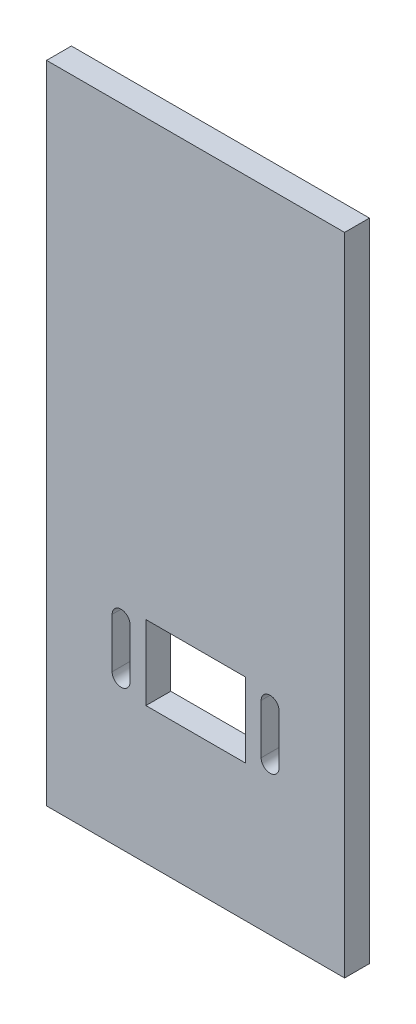
ISO-10303-21;
HEADER;
FILE_DESCRIPTION(('STEP AP214'),'2;1');
FILE_NAME('part.step','',(''),(''),'','','');
FILE_SCHEMA(('AUTOMOTIVE_DESIGN { 1 0 10303 214 1 1 1 1 }'));
ENDSEC;
DATA;
#1=APPLICATION_CONTEXT('core data for automotive mechanical design processes');
#2=APPLICATION_PROTOCOL_DEFINITION('international standard','automotive_design',2000,#1);
#3=PRODUCT_CONTEXT('',#1,'mechanical');
#4=PRODUCT('Part','Part','',(#3));
#5=PRODUCT_RELATED_PRODUCT_CATEGORY('part','',(#4));
#6=PRODUCT_DEFINITION_FORMATION('','',#4);
#7=PRODUCT_DEFINITION_CONTEXT('part definition',#1,'design');
#8=PRODUCT_DEFINITION('design','',#6,#7);
#9=PRODUCT_DEFINITION_SHAPE('','',#8);
#10=(LENGTH_UNIT() NAMED_UNIT(*) SI_UNIT(.MILLI.,.METRE.));
#11=(NAMED_UNIT(*) PLANE_ANGLE_UNIT() SI_UNIT($,.RADIAN.));
#12=(NAMED_UNIT(*) SI_UNIT($,.STERADIAN.) SOLID_ANGLE_UNIT());
#13=UNCERTAINTY_MEASURE_WITH_UNIT(LENGTH_MEASURE(1.E-05),#10,'distance_accuracy_value','');
#14=(GEOMETRIC_REPRESENTATION_CONTEXT(3) GLOBAL_UNCERTAINTY_ASSIGNED_CONTEXT((#13)) GLOBAL_UNIT_ASSIGNED_CONTEXT((#10,
#11,#12)) REPRESENTATION_CONTEXT('',''));
#15=CARTESIAN_POINT('',(0.,0.,0.));
#16=DIRECTION('',(0.,0.,1.));
#17=DIRECTION('',(1.,0.,0.));
#18=AXIS2_PLACEMENT_3D('',#15,#16,#17);
#19=CARTESIAN_POINT('',(30.,65.,5.));
#20=DIRECTION('',(-1.,0.,0.));
#21=DIRECTION('',(0.,-1.,0.));
#22=AXIS2_PLACEMENT_3D('',#19,#20,#21);
#23=PLANE('',#22);
#24=DIRECTION('',(0.,1.,0.));
#25=VECTOR('',#24,1.);
#26=CARTESIAN_POINT('',(30.,65.,0.));
#27=LINE('',#26,#25);
#28=CARTESIAN_POINT('',(30.,-65.,0.));
#29=VERTEX_POINT('',#28);
#30=CARTESIAN_POINT('',(30.,65.,0.));
#31=VERTEX_POINT('',#30);
#32=EDGE_CURVE('E291',#29,#31,#27,.T.);
#33=ORIENTED_EDGE('',*,*,#32,.T.);
#34=DIRECTION('',(0.,0.,-1.));
#35=VECTOR('',#34,1.);
#36=CARTESIAN_POINT('',(30.,65.,5.));
#37=LINE('',#36,#35);
#38=CARTESIAN_POINT('',(30.,65.,5.));
#39=VERTEX_POINT('',#38);
#40=EDGE_CURVE('E11',#39,#31,#37,.T.);
#41=ORIENTED_EDGE('',*,*,#40,.F.);
#42=DIRECTION('',(0.,1.,0.));
#43=VECTOR('',#42,1.);
#44=CARTESIAN_POINT('',(30.,65.,5.));
#45=LINE('',#44,#43);
#46=CARTESIAN_POINT('',(30.,-65.,5.));
#47=VERTEX_POINT('',#46);
#48=EDGE_CURVE('E292',#47,#39,#45,.T.);
#49=ORIENTED_EDGE('',*,*,#48,.F.);
#50=DIRECTION('',(0.,0.,-1.));
#51=VECTOR('',#50,1.);
#52=CARTESIAN_POINT('',(30.,-65.,5.));
#53=LINE('',#52,#51);
#54=EDGE_CURVE('E306',#47,#29,#53,.T.);
#55=ORIENTED_EDGE('',*,*,#54,.T.);
#56=EDGE_LOOP('',(#33,#41,#49,#55));
#57=FACE_BOUND('',#56,.T.);
#58=ADVANCED_FACE('F45',(#57),#23,.F.);
#59=CARTESIAN_POINT('',(-30.,65.,5.));
#60=DIRECTION('',(0.,-1.,0.));
#61=DIRECTION('',(0.,0.,-1.));
#62=AXIS2_PLACEMENT_3D('',#59,#60,#61);
#63=PLANE('',#62);
#64=DIRECTION('',(-1.,0.,0.));
#65=VECTOR('',#64,1.);
#66=CARTESIAN_POINT('',(-30.,65.,0.));
#67=LINE('',#66,#65);
#68=CARTESIAN_POINT('',(-30.,65.,0.));
#69=VERTEX_POINT('',#68);
#70=EDGE_CURVE('E310',#31,#69,#67,.T.);
#71=ORIENTED_EDGE('',*,*,#70,.T.);
#72=DIRECTION('',(0.,0.,-1.));
#73=VECTOR('',#72,1.);
#74=CARTESIAN_POINT('',(-30.,65.,5.));
#75=LINE('',#74,#73);
#76=CARTESIAN_POINT('',(-30.,65.,5.));
#77=VERTEX_POINT('',#76);
#78=EDGE_CURVE('E53',#77,#69,#75,.T.);
#79=ORIENTED_EDGE('',*,*,#78,.F.);
#80=DIRECTION('',(-1.,0.,0.));
#81=VECTOR('',#80,1.);
#82=CARTESIAN_POINT('',(-30.,65.,5.));
#83=LINE('',#82,#81);
#84=EDGE_CURVE('E296',#39,#77,#83,.T.);
#85=ORIENTED_EDGE('',*,*,#84,.F.);
#86=ORIENTED_EDGE('',*,*,#40,.T.);
#87=EDGE_LOOP('',(#71,#79,#85,#86));
#88=FACE_BOUND('',#87,.T.);
#89=ADVANCED_FACE('F345',(#88),#63,.F.);
#90=CARTESIAN_POINT('',(-30.,65.,5.));
#91=DIRECTION('',(1.,0.,0.));
#92=DIRECTION('',(0.,1.,0.));
#93=AXIS2_PLACEMENT_3D('',#90,#91,#92);
#94=PLANE('',#93);
#95=DIRECTION('',(0.,-1.,0.));
#96=VECTOR('',#95,1.);
#97=CARTESIAN_POINT('',(-30.,65.,0.));
#98=LINE('',#97,#96);
#99=CARTESIAN_POINT('',(-30.,-65.,0.));
#100=VERTEX_POINT('',#99);
#101=EDGE_CURVE('E313',#69,#100,#98,.T.);
#102=ORIENTED_EDGE('',*,*,#101,.T.);
#103=DIRECTION('',(0.,0.,-1.));
#104=VECTOR('',#103,1.);
#105=CARTESIAN_POINT('',(-30.,-65.,5.));
#106=LINE('',#105,#104);
#107=CARTESIAN_POINT('',(-30.,-65.,5.));
#108=VERTEX_POINT('',#107);
#109=EDGE_CURVE('E321',#108,#100,#106,.T.);
#110=ORIENTED_EDGE('',*,*,#109,.F.);
#111=DIRECTION('',(0.,-1.,0.));
#112=VECTOR('',#111,1.);
#113=CARTESIAN_POINT('',(-30.,65.,5.));
#114=LINE('',#113,#112);
#115=EDGE_CURVE('E300',#77,#108,#114,.T.);
#116=ORIENTED_EDGE('',*,*,#115,.F.);
#117=ORIENTED_EDGE('',*,*,#78,.T.);
#118=EDGE_LOOP('',(#102,#110,#116,#117));
#119=FACE_BOUND('',#118,.T.);
#120=ADVANCED_FACE('F330',(#119),#94,.F.);
#121=CARTESIAN_POINT('',(-30.,-65.,5.));
#122=DIRECTION('',(0.,1.,0.));
#123=DIRECTION('',(0.,0.,1.));
#124=AXIS2_PLACEMENT_3D('',#121,#122,#123);
#125=PLANE('',#124);
#126=DIRECTION('',(1.,0.,0.));
#127=VECTOR('',#126,1.);
#128=CARTESIAN_POINT('',(-30.,-65.,0.));
#129=LINE('',#128,#127);
#130=EDGE_CURVE('E297',#100,#29,#129,.T.);
#131=ORIENTED_EDGE('',*,*,#130,.T.);
#132=ORIENTED_EDGE('',*,*,#54,.F.);
#133=DIRECTION('',(1.,0.,0.));
#134=VECTOR('',#133,1.);
#135=CARTESIAN_POINT('',(-30.,-65.,5.));
#136=LINE('',#135,#134);
#137=EDGE_CURVE('E303',#108,#47,#136,.T.);
#138=ORIENTED_EDGE('',*,*,#137,.F.);
#139=ORIENTED_EDGE('',*,*,#109,.T.);
#140=EDGE_LOOP('',(#131,#132,#138,#139));
#141=FACE_BOUND('',#140,.T.);
#142=ADVANCED_FACE('F339',(#141),#125,.F.);
#143=CARTESIAN_POINT('',(0.,0.,5.));
#144=DIRECTION('',(0.,0.,1.));
#145=DIRECTION('',(1.,0.,0.));
#146=AXIS2_PLACEMENT_3D('',#143,#144,#145);
#147=PLANE('',#146);
#148=DIRECTION('',(0.,-1.,0.));
#149=VECTOR('',#148,1.);
#150=CARTESIAN_POINT('',(-13.2,-25.,5.));
#151=LINE('',#150,#149);
#152=CARTESIAN_POINT('',(-13.2,-25.,5.));
#153=VERTEX_POINT('',#152);
#154=CARTESIAN_POINT('',(-13.2,-35.,5.));
#155=VERTEX_POINT('',#154);
#156=EDGE_CURVE('E172',#153,#155,#151,.T.);
#157=ORIENTED_EDGE('',*,*,#156,.T.);
#158=CARTESIAN_POINT('',(-15.,-35.,5.));
#159=DIRECTION('',(0.,0.,1.));
#160=DIRECTION('',(1.,0.,0.));
#161=AXIS2_PLACEMENT_3D('',#158,#159,#160);
#162=CIRCLE('',#161,1.8);
#163=CARTESIAN_POINT('',(-16.8,-35.,5.));
#164=VERTEX_POINT('',#163);
#165=EDGE_CURVE('E158',#155,#164,#162,.F.);
#166=ORIENTED_EDGE('',*,*,#165,.T.);
#167=DIRECTION('',(0.,1.,0.));
#168=VECTOR('',#167,1.);
#169=CARTESIAN_POINT('',(-16.8,-25.,5.));
#170=LINE('',#169,#168);
#171=CARTESIAN_POINT('',(-16.8,-25.,5.));
#172=VERTEX_POINT('',#171);
#173=EDGE_CURVE('E195',#164,#172,#170,.T.);
#174=ORIENTED_EDGE('',*,*,#173,.T.);
#175=CARTESIAN_POINT('',(-15.,-25.,5.));
#176=DIRECTION('',(0.,0.,1.));
#177=DIRECTION('',(1.,0.,0.));
#178=AXIS2_PLACEMENT_3D('',#175,#176,#177);
#179=CIRCLE('',#178,1.8);
#180=EDGE_CURVE('E181',#172,#153,#179,.F.);
#181=ORIENTED_EDGE('',*,*,#180,.T.);
#182=EDGE_LOOP('',(#157,#166,#174,#181));
#183=FACE_BOUND('',#182,.T.);
#184=DIRECTION('',(0.,-1.,0.));
#185=VECTOR('',#184,1.);
#186=CARTESIAN_POINT('',(16.8,-25.,5.));
#187=LINE('',#186,#185);
#188=CARTESIAN_POINT('',(16.8,-25.,5.));
#189=VERTEX_POINT('',#188);
#190=CARTESIAN_POINT('',(16.8,-35.,5.));
#191=VERTEX_POINT('',#190);
#192=EDGE_CURVE('E212',#189,#191,#187,.T.);
#193=ORIENTED_EDGE('',*,*,#192,.T.);
#194=CARTESIAN_POINT('',(15.,-35.,5.));
#195=DIRECTION('',(0.,0.,1.));
#196=DIRECTION('',(1.,0.,0.));
#197=AXIS2_PLACEMENT_3D('',#194,#195,#196);
#198=CIRCLE('',#197,1.8);
#199=CARTESIAN_POINT('',(13.2,-35.,5.));
#200=VERTEX_POINT('',#199);
#201=EDGE_CURVE('E213',#191,#200,#198,.F.);
#202=ORIENTED_EDGE('',*,*,#201,.T.);
#203=DIRECTION('',(0.,1.,0.));
#204=VECTOR('',#203,1.);
#205=CARTESIAN_POINT('',(13.2,-25.,5.));
#206=LINE('',#205,#204);
#207=CARTESIAN_POINT('',(13.2,-25.,5.));
#208=VERTEX_POINT('',#207);
#209=EDGE_CURVE('E217',#200,#208,#206,.T.);
#210=ORIENTED_EDGE('',*,*,#209,.T.);
#211=CARTESIAN_POINT('',(15.,-25.,5.));
#212=DIRECTION('',(0.,0.,1.));
#213=DIRECTION('',(1.,0.,0.));
#214=AXIS2_PLACEMENT_3D('',#211,#212,#213);
#215=CIRCLE('',#214,1.8);
#216=EDGE_CURVE('E208',#208,#189,#215,.F.);
#217=ORIENTED_EDGE('',*,*,#216,.T.);
#218=EDGE_LOOP('',(#193,#202,#210,#217));
#219=FACE_BOUND('',#218,.T.);
#220=DIRECTION('',(1.,0.,0.));
#221=VECTOR('',#220,1.);
#222=CARTESIAN_POINT('',(10.,-22.5,5.));
#223=LINE('',#222,#221);
#224=CARTESIAN_POINT('',(-10.,-22.5,5.));
#225=VERTEX_POINT('',#224);
#226=CARTESIAN_POINT('',(10.,-22.5,5.00000000000001));
#227=VERTEX_POINT('',#226);
#228=EDGE_CURVE('E251',#225,#227,#223,.T.);
#229=ORIENTED_EDGE('',*,*,#228,.T.);
#230=DIRECTION('',(0.,-1.,0.));
#231=VECTOR('',#230,1.);
#232=CARTESIAN_POINT('',(10.,-22.5,5.));
#233=LINE('',#232,#231);
#234=CARTESIAN_POINT('',(10.,-37.5,5.));
#235=VERTEX_POINT('',#234);
#236=EDGE_CURVE('E278',#227,#235,#233,.T.);
#237=ORIENTED_EDGE('',*,*,#236,.T.);
#238=DIRECTION('',(-1.,0.,0.));
#239=VECTOR('',#238,1.);
#240=CARTESIAN_POINT('',(10.,-37.5,5.));
#241=LINE('',#240,#239);
#242=CARTESIAN_POINT('',(-10.,-37.5,5.));
#243=VERTEX_POINT('',#242);
#244=EDGE_CURVE('E273',#235,#243,#241,.T.);
#245=ORIENTED_EDGE('',*,*,#244,.T.);
#246=DIRECTION('',(0.,1.,0.));
#247=VECTOR('',#246,1.);
#248=CARTESIAN_POINT('',(-10.,-22.5,5.));
#249=LINE('',#248,#247);
#250=EDGE_CURVE('E267',#243,#225,#249,.T.);
#251=ORIENTED_EDGE('',*,*,#250,.T.);
#252=EDGE_LOOP('',(#229,#237,#245,#251));
#253=FACE_BOUND('',#252,.T.);
#254=ORIENTED_EDGE('',*,*,#48,.T.);
#255=ORIENTED_EDGE('',*,*,#84,.T.);
#256=ORIENTED_EDGE('',*,*,#115,.T.);
#257=ORIENTED_EDGE('',*,*,#137,.T.);
#258=EDGE_LOOP('',(#254,#255,#256,#257));
#259=FACE_BOUND('',#258,.T.);
#260=ADVANCED_FACE('F179',(#183,#219,#253,#259),#147,.T.);
#261=CARTESIAN_POINT('',(0.,0.,0.));
#262=DIRECTION('',(0.,0.,1.));
#263=DIRECTION('',(1.,0.,0.));
#264=AXIS2_PLACEMENT_3D('',#261,#262,#263);
#265=PLANE('',#264);
#266=CARTESIAN_POINT('',(-15.,-35.,0.));
#267=DIRECTION('',(0.,0.,-1.));
#268=DIRECTION('',(-1.,0.,0.));
#269=AXIS2_PLACEMENT_3D('',#266,#267,#268);
#270=CIRCLE('',#269,1.8);
#271=CARTESIAN_POINT('',(-13.2,-35.,0.));
#272=VERTEX_POINT('',#271);
#273=CARTESIAN_POINT('',(-16.8,-35.,0.));
#274=VERTEX_POINT('',#273);
#275=EDGE_CURVE('E186',#272,#274,#270,.T.);
#276=ORIENTED_EDGE('',*,*,#275,.F.);
#277=DIRECTION('',(0.,-1.,0.));
#278=VECTOR('',#277,1.);
#279=CARTESIAN_POINT('',(-13.2,-25.,0.));
#280=LINE('',#279,#278);
#281=CARTESIAN_POINT('',(-13.2,-25.,0.));
#282=VERTEX_POINT('',#281);
#283=EDGE_CURVE('E175',#282,#272,#280,.T.);
#284=ORIENTED_EDGE('',*,*,#283,.F.);
#285=CARTESIAN_POINT('',(-15.,-25.,0.));
#286=DIRECTION('',(0.,0.,-1.));
#287=DIRECTION('',(-1.,0.,0.));
#288=AXIS2_PLACEMENT_3D('',#285,#286,#287);
#289=CIRCLE('',#288,1.8);
#290=CARTESIAN_POINT('',(-16.8,-25.,0.));
#291=VERTEX_POINT('',#290);
#292=EDGE_CURVE('E190',#291,#282,#289,.T.);
#293=ORIENTED_EDGE('',*,*,#292,.F.);
#294=DIRECTION('',(0.,1.,0.));
#295=VECTOR('',#294,1.);
#296=CARTESIAN_POINT('',(-16.8,-25.,0.));
#297=LINE('',#296,#295);
#298=EDGE_CURVE('E183',#274,#291,#297,.T.);
#299=ORIENTED_EDGE('',*,*,#298,.F.);
#300=EDGE_LOOP('',(#276,#284,#293,#299));
#301=FACE_BOUND('',#300,.T.);
#302=CARTESIAN_POINT('',(15.,-35.,0.));
#303=DIRECTION('',(0.,0.,-1.));
#304=DIRECTION('',(-1.,0.,0.));
#305=AXIS2_PLACEMENT_3D('',#302,#303,#304);
#306=CIRCLE('',#305,1.8);
#307=CARTESIAN_POINT('',(16.8,-35.,0.));
#308=VERTEX_POINT('',#307);
#309=CARTESIAN_POINT('',(13.2,-35.,0.));
#310=VERTEX_POINT('',#309);
#311=EDGE_CURVE('E242',#308,#310,#306,.T.);
#312=ORIENTED_EDGE('',*,*,#311,.F.);
#313=DIRECTION('',(0.,-1.,0.));
#314=VECTOR('',#313,1.);
#315=CARTESIAN_POINT('',(16.8,-25.,0.));
#316=LINE('',#315,#314);
#317=CARTESIAN_POINT('',(16.8,-25.,0.));
#318=VERTEX_POINT('',#317);
#319=EDGE_CURVE('E238',#318,#308,#316,.T.);
#320=ORIENTED_EDGE('',*,*,#319,.F.);
#321=CARTESIAN_POINT('',(15.,-25.,0.));
#322=DIRECTION('',(0.,0.,-1.));
#323=DIRECTION('',(-1.,0.,0.));
#324=AXIS2_PLACEMENT_3D('',#321,#322,#323);
#325=CIRCLE('',#324,1.8);
#326=CARTESIAN_POINT('',(13.2,-25.,0.));
#327=VERTEX_POINT('',#326);
#328=EDGE_CURVE('E235',#327,#318,#325,.T.);
#329=ORIENTED_EDGE('',*,*,#328,.F.);
#330=DIRECTION('',(0.,1.,0.));
#331=VECTOR('',#330,1.);
#332=CARTESIAN_POINT('',(13.2,-25.,0.));
#333=LINE('',#332,#331);
#334=EDGE_CURVE('E234',#310,#327,#333,.T.);
#335=ORIENTED_EDGE('',*,*,#334,.F.);
#336=EDGE_LOOP('',(#312,#320,#329,#335));
#337=FACE_BOUND('',#336,.T.);
#338=DIRECTION('',(0.,-1.,0.));
#339=VECTOR('',#338,1.);
#340=CARTESIAN_POINT('',(10.,-22.5,0.));
#341=LINE('',#340,#339);
#342=CARTESIAN_POINT('',(10.,-22.5,0.));
#343=VERTEX_POINT('',#342);
#344=CARTESIAN_POINT('',(10.,-37.5,0.));
#345=VERTEX_POINT('',#344);
#346=EDGE_CURVE('E252',#343,#345,#341,.T.);
#347=ORIENTED_EDGE('',*,*,#346,.F.);
#348=DIRECTION('',(1.,0.,0.));
#349=VECTOR('',#348,1.);
#350=CARTESIAN_POINT('',(10.,-22.5,0.));
#351=LINE('',#350,#349);
#352=CARTESIAN_POINT('',(-10.,-22.5,0.));
#353=VERTEX_POINT('',#352);
#354=EDGE_CURVE('E256',#353,#343,#351,.T.);
#355=ORIENTED_EDGE('',*,*,#354,.F.);
#356=DIRECTION('',(0.,1.,0.));
#357=VECTOR('',#356,1.);
#358=CARTESIAN_POINT('',(-10.,-22.5,0.));
#359=LINE('',#358,#357);
#360=CARTESIAN_POINT('',(-10.,-37.5,0.));
#361=VERTEX_POINT('',#360);
#362=EDGE_CURVE('E205',#361,#353,#359,.T.);
#363=ORIENTED_EDGE('',*,*,#362,.F.);
#364=DIRECTION('',(-1.,0.,0.));
#365=VECTOR('',#364,1.);
#366=CARTESIAN_POINT('',(10.,-37.5,0.));
#367=LINE('',#366,#365);
#368=EDGE_CURVE('E248',#345,#361,#367,.T.);
#369=ORIENTED_EDGE('',*,*,#368,.F.);
#370=EDGE_LOOP('',(#347,#355,#363,#369));
#371=FACE_BOUND('',#370,.T.);
#372=ORIENTED_EDGE('',*,*,#32,.F.);
#373=ORIENTED_EDGE('',*,*,#130,.F.);
#374=ORIENTED_EDGE('',*,*,#101,.F.);
#375=ORIENTED_EDGE('',*,*,#70,.F.);
#376=EDGE_LOOP('',(#372,#373,#374,#375));
#377=FACE_BOUND('',#376,.T.);
#378=ADVANCED_FACE('F336',(#301,#337,#371,#377),#265,.F.);
#379=CARTESIAN_POINT('',(10.,-22.5,30.));
#380=DIRECTION('',(0.,1.,0.));
#381=DIRECTION('',(0.,0.,1.));
#382=AXIS2_PLACEMENT_3D('',#379,#380,#381);
#383=PLANE('',#382);
#384=DIRECTION('',(0.,0.,-1.));
#385=VECTOR('',#384,1.);
#386=CARTESIAN_POINT('',(-10.,-22.5,30.));
#387=LINE('',#386,#385);
#388=EDGE_CURVE('E271',#225,#353,#387,.T.);
#389=ORIENTED_EDGE('',*,*,#388,.T.);
#390=ORIENTED_EDGE('',*,*,#354,.T.);
#391=DIRECTION('',(0.,0.,-1.));
#392=VECTOR('',#391,1.);
#393=CARTESIAN_POINT('',(10.,-22.5,30.));
#394=LINE('',#393,#392);
#395=EDGE_CURVE('E266',#227,#343,#394,.T.);
#396=ORIENTED_EDGE('',*,*,#395,.F.);
#397=ORIENTED_EDGE('',*,*,#228,.F.);
#398=EDGE_LOOP('',(#389,#390,#396,#397));
#399=FACE_BOUND('',#398,.T.);
#400=ADVANCED_FACE('F357',(#399),#383,.F.);
#401=CARTESIAN_POINT('',(10.,-22.5,30.));
#402=DIRECTION('',(1.,0.,0.));
#403=DIRECTION('',(0.,1.,0.));
#404=AXIS2_PLACEMENT_3D('',#401,#402,#403);
#405=PLANE('',#404);
#406=ORIENTED_EDGE('',*,*,#395,.T.);
#407=ORIENTED_EDGE('',*,*,#346,.T.);
#408=DIRECTION('',(0.,0.,-1.));
#409=VECTOR('',#408,1.);
#410=CARTESIAN_POINT('',(10.,-37.5,30.));
#411=LINE('',#410,#409);
#412=EDGE_CURVE('E277',#235,#345,#411,.T.);
#413=ORIENTED_EDGE('',*,*,#412,.F.);
#414=ORIENTED_EDGE('',*,*,#236,.F.);
#415=EDGE_LOOP('',(#406,#407,#413,#414));
#416=FACE_BOUND('',#415,.T.);
#417=ADVANCED_FACE('F363',(#416),#405,.F.);
#418=CARTESIAN_POINT('',(10.,-37.5,30.));
#419=DIRECTION('',(0.,-1.,0.));
#420=DIRECTION('',(0.,0.,-1.));
#421=AXIS2_PLACEMENT_3D('',#418,#419,#420);
#422=PLANE('',#421);
#423=ORIENTED_EDGE('',*,*,#412,.T.);
#424=ORIENTED_EDGE('',*,*,#368,.T.);
#425=DIRECTION('',(0.,0.,-1.));
#426=VECTOR('',#425,1.);
#427=CARTESIAN_POINT('',(-10.,-37.5,30.));
#428=LINE('',#427,#426);
#429=EDGE_CURVE('E272',#243,#361,#428,.T.);
#430=ORIENTED_EDGE('',*,*,#429,.F.);
#431=ORIENTED_EDGE('',*,*,#244,.F.);
#432=EDGE_LOOP('',(#423,#424,#430,#431));
#433=FACE_BOUND('',#432,.T.);
#434=ADVANCED_FACE('F367',(#433),#422,.F.);
#435=CARTESIAN_POINT('',(-10.,-22.5,30.));
#436=DIRECTION('',(-1.,0.,0.));
#437=DIRECTION('',(0.,0.,1.));
#438=AXIS2_PLACEMENT_3D('',#435,#436,#437);
#439=PLANE('',#438);
#440=ORIENTED_EDGE('',*,*,#429,.T.);
#441=ORIENTED_EDGE('',*,*,#362,.T.);
#442=ORIENTED_EDGE('',*,*,#388,.F.);
#443=ORIENTED_EDGE('',*,*,#250,.F.);
#444=EDGE_LOOP('',(#440,#441,#442,#443));
#445=FACE_BOUND('',#444,.T.);
#446=ADVANCED_FACE('F371',(#445),#439,.F.);
#447=CARTESIAN_POINT('',(16.8,-25.,19.0684043160552));
#448=DIRECTION('',(1.,0.,0.));
#449=DIRECTION('',(0.,0.,-1.));
#450=AXIS2_PLACEMENT_3D('',#447,#448,#449);
#451=PLANE('',#450);
#452=DIRECTION('',(0.,0.,-1.));
#453=VECTOR('',#452,1.);
#454=CARTESIAN_POINT('',(16.8,-25.,19.0684043160552));
#455=LINE('',#454,#453);
#456=EDGE_CURVE('E68',#189,#318,#455,.T.);
#457=ORIENTED_EDGE('',*,*,#456,.T.);
#458=ORIENTED_EDGE('',*,*,#319,.T.);
#459=DIRECTION('',(0.,0.,-1.));
#460=VECTOR('',#459,1.);
#461=CARTESIAN_POINT('',(16.8,-35.,19.0684043160552));
#462=LINE('',#461,#460);
#463=EDGE_CURVE('E209',#191,#308,#462,.T.);
#464=ORIENTED_EDGE('',*,*,#463,.F.);
#465=ORIENTED_EDGE('',*,*,#192,.F.);
#466=EDGE_LOOP('',(#457,#458,#464,#465));
#467=FACE_BOUND('',#466,.T.);
#468=ADVANCED_FACE('F375',(#467),#451,.F.);
#469=CARTESIAN_POINT('',(15.,-35.,19.0684043160552));
#470=DIRECTION('',(0.,0.,-1.));
#471=DIRECTION('',(-1.,0.,0.));
#472=AXIS2_PLACEMENT_3D('',#469,#470,#471);
#473=CYLINDRICAL_SURFACE('',#472,1.8);
#474=ORIENTED_EDGE('',*,*,#463,.T.);
#475=ORIENTED_EDGE('',*,*,#311,.T.);
#476=DIRECTION('',(0.,0.,-1.));
#477=VECTOR('',#476,1.);
#478=CARTESIAN_POINT('',(13.2,-35.,19.0684043160552));
#479=LINE('',#478,#477);
#480=EDGE_CURVE('E214',#200,#310,#479,.T.);
#481=ORIENTED_EDGE('',*,*,#480,.F.);
#482=ORIENTED_EDGE('',*,*,#201,.F.);
#483=EDGE_LOOP('',(#474,#475,#481,#482));
#484=FACE_BOUND('',#483,.T.);
#485=ADVANCED_FACE('F383',(#484),#473,.F.);
#486=CARTESIAN_POINT('',(13.2,-25.,19.0684043160552));
#487=DIRECTION('',(-1.,0.,0.));
#488=DIRECTION('',(0.,-1.,0.));
#489=AXIS2_PLACEMENT_3D('',#486,#487,#488);
#490=PLANE('',#489);
#491=ORIENTED_EDGE('',*,*,#480,.T.);
#492=ORIENTED_EDGE('',*,*,#334,.T.);
#493=DIRECTION('',(0.,0.,-1.));
#494=VECTOR('',#493,1.);
#495=CARTESIAN_POINT('',(13.2,-25.,19.0684043160552));
#496=LINE('',#495,#494);
#497=EDGE_CURVE('E218',#208,#327,#496,.T.);
#498=ORIENTED_EDGE('',*,*,#497,.F.);
#499=ORIENTED_EDGE('',*,*,#209,.F.);
#500=EDGE_LOOP('',(#491,#492,#498,#499));
#501=FACE_BOUND('',#500,.T.);
#502=ADVANCED_FACE('F380',(#501),#490,.F.);
#503=CARTESIAN_POINT('',(15.,-25.,19.0684043160552));
#504=DIRECTION('',(0.,0.,-1.));
#505=DIRECTION('',(-1.,0.,0.));
#506=AXIS2_PLACEMENT_3D('',#503,#504,#505);
#507=CYLINDRICAL_SURFACE('',#506,1.8);
#508=ORIENTED_EDGE('',*,*,#497,.T.);
#509=ORIENTED_EDGE('',*,*,#328,.T.);
#510=ORIENTED_EDGE('',*,*,#456,.F.);
#511=ORIENTED_EDGE('',*,*,#216,.F.);
#512=EDGE_LOOP('',(#508,#509,#510,#511));
#513=FACE_BOUND('',#512,.T.);
#514=ADVANCED_FACE('F377',(#513),#507,.F.);
#515=CARTESIAN_POINT('',(-13.2,-25.,19.0684043160552));
#516=DIRECTION('',(1.,0.,0.));
#517=DIRECTION('',(0.,1.,0.));
#518=AXIS2_PLACEMENT_3D('',#515,#516,#517);
#519=PLANE('',#518);
#520=DIRECTION('',(0.,0.,-1.));
#521=VECTOR('',#520,1.);
#522=CARTESIAN_POINT('',(-13.2,-25.,19.0684043160552));
#523=LINE('',#522,#521);
#524=EDGE_CURVE('E60',#153,#282,#523,.T.);
#525=ORIENTED_EDGE('',*,*,#524,.T.);
#526=ORIENTED_EDGE('',*,*,#283,.T.);
#527=DIRECTION('',(0.,0.,-1.));
#528=VECTOR('',#527,1.);
#529=CARTESIAN_POINT('',(-13.2,-35.,19.0684043160552));
#530=LINE('',#529,#528);
#531=EDGE_CURVE('E162',#155,#272,#530,.T.);
#532=ORIENTED_EDGE('',*,*,#531,.F.);
#533=ORIENTED_EDGE('',*,*,#156,.F.);
#534=EDGE_LOOP('',(#525,#526,#532,#533));
#535=FACE_BOUND('',#534,.T.);
#536=ADVANCED_FACE('F171',(#535),#519,.F.);
#537=CARTESIAN_POINT('',(-15.,-35.,19.0684043160552));
#538=DIRECTION('',(0.,0.,-1.));
#539=DIRECTION('',(-1.,0.,0.));
#540=AXIS2_PLACEMENT_3D('',#537,#538,#539);
#541=CYLINDRICAL_SURFACE('',#540,1.8);
#542=ORIENTED_EDGE('',*,*,#531,.T.);
#543=ORIENTED_EDGE('',*,*,#275,.T.);
#544=DIRECTION('',(0.,0.,-1.));
#545=VECTOR('',#544,1.);
#546=CARTESIAN_POINT('',(-16.8,-35.,19.0684043160552));
#547=LINE('',#546,#545);
#548=EDGE_CURVE('E164',#164,#274,#547,.T.);
#549=ORIENTED_EDGE('',*,*,#548,.F.);
#550=ORIENTED_EDGE('',*,*,#165,.F.);
#551=EDGE_LOOP('',(#542,#543,#549,#550));
#552=FACE_BOUND('',#551,.T.);
#553=ADVANCED_FACE('F160',(#552),#541,.F.);
#554=CARTESIAN_POINT('',(-16.8,-25.,19.0684043160552));
#555=DIRECTION('',(-1.,0.,0.));
#556=DIRECTION('',(0.,-1.,0.));
#557=AXIS2_PLACEMENT_3D('',#554,#555,#556);
#558=PLANE('',#557);
#559=ORIENTED_EDGE('',*,*,#548,.T.);
#560=ORIENTED_EDGE('',*,*,#298,.T.);
#561=DIRECTION('',(0.,0.,-1.));
#562=VECTOR('',#561,1.);
#563=CARTESIAN_POINT('',(-16.8,-25.,19.0684043160552));
#564=LINE('',#563,#562);
#565=EDGE_CURVE('E194',#172,#291,#564,.T.);
#566=ORIENTED_EDGE('',*,*,#565,.F.);
#567=ORIENTED_EDGE('',*,*,#173,.F.);
#568=EDGE_LOOP('',(#559,#560,#566,#567));
#569=FACE_BOUND('',#568,.T.);
#570=ADVANCED_FACE('F395',(#569),#558,.F.);
#571=CARTESIAN_POINT('',(-15.,-25.,19.0684043160552));
#572=DIRECTION('',(0.,0.,-1.));
#573=DIRECTION('',(-1.,0.,0.));
#574=AXIS2_PLACEMENT_3D('',#571,#572,#573);
#575=CYLINDRICAL_SURFACE('',#574,1.8);
#576=ORIENTED_EDGE('',*,*,#565,.T.);
#577=ORIENTED_EDGE('',*,*,#292,.T.);
#578=ORIENTED_EDGE('',*,*,#524,.F.);
#579=ORIENTED_EDGE('',*,*,#180,.F.);
#580=EDGE_LOOP('',(#576,#577,#578,#579));
#581=FACE_BOUND('',#580,.T.);
#582=ADVANCED_FACE('F398',(#581),#575,.F.);
#583=CLOSED_SHELL('',(#58,#89,#120,#142,#260,#378,#400,#417,#434,#446,#468,#485,#502,#514,#536,
#553,#570,#582));
#584=MANIFOLD_SOLID_BREP('B2',#583);
#585=ADVANCED_BREP_SHAPE_REPRESENTATION('',(#18,#584),#14);
#586=SHAPE_DEFINITION_REPRESENTATION(#9,#585);
ENDSEC;
END-ISO-10303-21;
